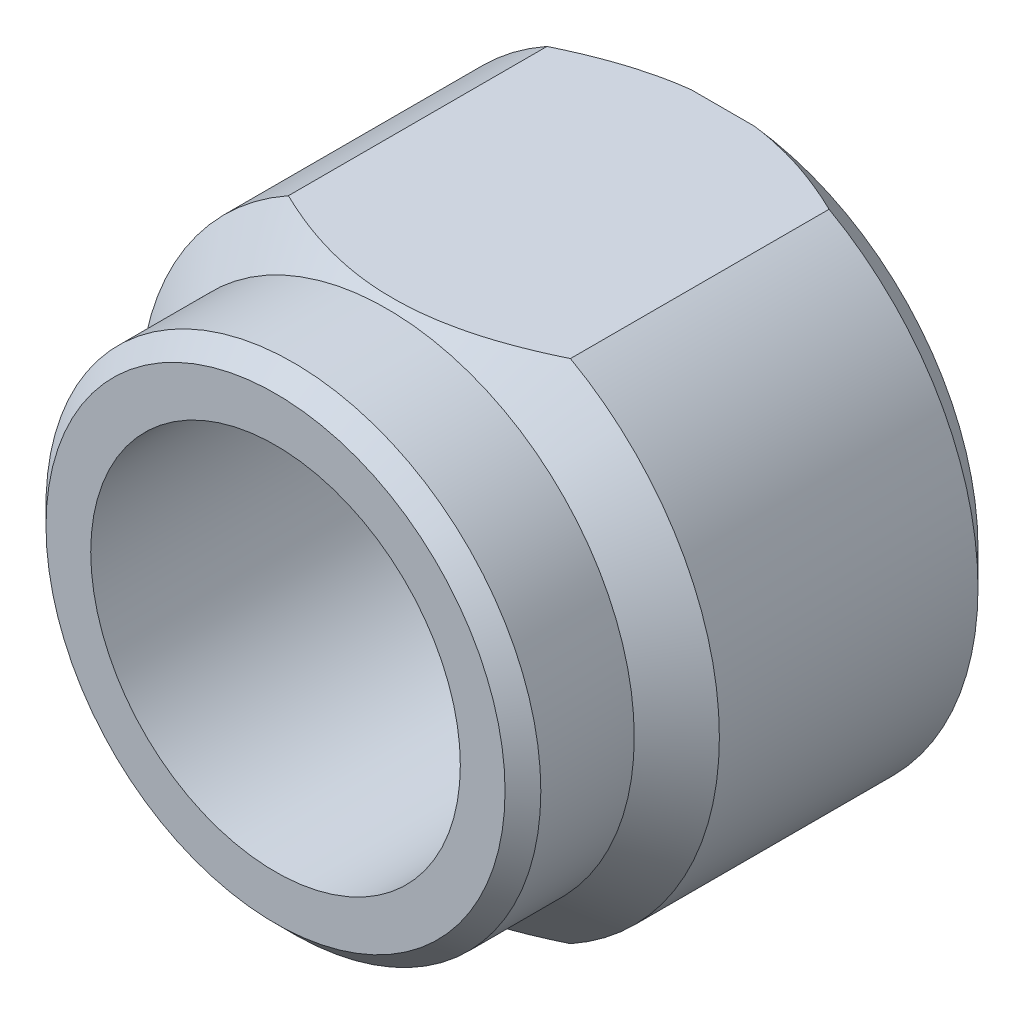
ISO-10303-21;
HEADER;
FILE_DESCRIPTION(('STEP AP214'),'2;1');
FILE_NAME('part.step','',(''),(''),'','','');
FILE_SCHEMA(('AUTOMOTIVE_DESIGN { 1 0 10303 214 1 1 1 1 }'));
ENDSEC;
DATA;
#1=APPLICATION_CONTEXT('core data for automotive mechanical design processes');
#2=APPLICATION_PROTOCOL_DEFINITION('international standard','automotive_design',2000,#1);
#3=PRODUCT_CONTEXT('',#1,'mechanical');
#4=PRODUCT('Part','Part','',(#3));
#5=PRODUCT_RELATED_PRODUCT_CATEGORY('part','',(#4));
#6=PRODUCT_DEFINITION_FORMATION('','',#4);
#7=PRODUCT_DEFINITION_CONTEXT('part definition',#1,'design');
#8=PRODUCT_DEFINITION('design','',#6,#7);
#9=PRODUCT_DEFINITION_SHAPE('','',#8);
#10=(LENGTH_UNIT() NAMED_UNIT(*) SI_UNIT(.MILLI.,.METRE.));
#11=(NAMED_UNIT(*) PLANE_ANGLE_UNIT() SI_UNIT($,.RADIAN.));
#12=(NAMED_UNIT(*) SI_UNIT($,.STERADIAN.) SOLID_ANGLE_UNIT());
#13=UNCERTAINTY_MEASURE_WITH_UNIT(LENGTH_MEASURE(1.E-05),#10,'distance_accuracy_value','');
#14=(GEOMETRIC_REPRESENTATION_CONTEXT(3) GLOBAL_UNCERTAINTY_ASSIGNED_CONTEXT((#13)) GLOBAL_UNIT_ASSIGNED_CONTEXT((#10,
#11,#12)) REPRESENTATION_CONTEXT('',''));
#15=CARTESIAN_POINT('',(0.,0.,0.));
#16=DIRECTION('',(0.,0.,1.));
#17=DIRECTION('',(1.,0.,0.));
#18=AXIS2_PLACEMENT_3D('',#15,#16,#17);
#19=CARTESIAN_POINT('',(0.,0.,0.));
#20=DIRECTION('',(0.,0.,1.));
#21=DIRECTION('',(1.,0.,0.));
#22=AXIS2_PLACEMENT_3D('',#19,#20,#21);
#23=CYLINDRICAL_SURFACE('',#22,4.864);
#24=CARTESIAN_POINT('',(0.,0.,0.581));
#25=DIRECTION('',(0.,0.,1.));
#26=DIRECTION('',(1.,0.,0.));
#27=AXIS2_PLACEMENT_3D('',#24,#25,#26);
#28=CIRCLE('',#27,4.864);
#29=CARTESIAN_POINT('',(2.36558576255438,-4.25,0.581));
#30=VERTEX_POINT('',#29);
#31=CARTESIAN_POINT('',(2.36558576255438,4.25,0.581));
#32=VERTEX_POINT('',#31);
#33=EDGE_CURVE('E146',#30,#32,#28,.T.);
#34=ORIENTED_EDGE('',*,*,#33,.T.);
#35=DIRECTION('',(0.,0.,1.));
#36=VECTOR('',#35,1.);
#37=CARTESIAN_POINT('',(2.36558576255438,4.25,0.));
#38=LINE('',#37,#36);
#39=CARTESIAN_POINT('',(2.36558576255438,4.25,4.919));
#40=VERTEX_POINT('',#39);
#41=EDGE_CURVE('E72',#32,#40,#38,.T.);
#42=ORIENTED_EDGE('',*,*,#41,.T.);
#43=CARTESIAN_POINT('',(0.,0.,4.919));
#44=DIRECTION('',(0.,0.,1.));
#45=DIRECTION('',(1.,0.,0.));
#46=AXIS2_PLACEMENT_3D('',#43,#44,#45);
#47=CIRCLE('',#46,4.864);
#48=CARTESIAN_POINT('',(2.36558576255438,-4.25,4.919));
#49=VERTEX_POINT('',#48);
#50=EDGE_CURVE('E156',#49,#40,#47,.T.);
#51=ORIENTED_EDGE('',*,*,#50,.F.);
#52=DIRECTION('',(0.,0.,1.));
#53=VECTOR('',#52,1.);
#54=CARTESIAN_POINT('',(2.36558576255438,-4.25,0.));
#55=LINE('',#54,#53);
#56=EDGE_CURVE('E199',#49,#30,#55,.F.);
#57=ORIENTED_EDGE('',*,*,#56,.T.);
#58=EDGE_LOOP('',(#34,#42,#51,#57));
#59=FACE_BOUND('',#58,.T.);
#60=ADVANCED_FACE('F43',(#59),#23,.T.);
#61=CARTESIAN_POINT('',(0.,0.,0.));
#62=DIRECTION('',(0.,0.,1.));
#63=DIRECTION('',(1.,0.,0.));
#64=AXIS2_PLACEMENT_3D('',#61,#62,#63);
#65=CONICAL_SURFACE('',#64,4.283,0.785398163397448);
#66=CARTESIAN_POINT('',(-2.36558576255438,4.25,0.581));
#67=VERTEX_POINT('',#66);
#68=CARTESIAN_POINT('',(-2.36558576255438,-4.25,0.581));
#69=VERTEX_POINT('',#68);
#70=EDGE_CURVE('E149',#67,#69,#28,.T.);
#71=ORIENTED_EDGE('',*,*,#70,.F.);
#72=CARTESIAN_POINT('',(-2.36702473371108,4.25,0.5817));
#73=CARTESIAN_POINT('',(-2.20341546665873,4.25,0.502152170576481));
#74=CARTESIAN_POINT('',(-2.03712267941439,4.25,0.427476792158866));
#75=CARTESIAN_POINT('',(-1.69832613474606,4.25,0.291111280149651));
#76=CARTESIAN_POINT('',(-1.52579435124547,4.25,0.229491383279684));
#77=CARTESIAN_POINT('',(-1.17795648173534,4.25,0.124164439222786));
#78=CARTESIAN_POINT('',(-1.00272785043013,4.25,0.0802086426752905));
#79=CARTESIAN_POINT('',(-0.648661502752726,4.25,0.0127223622306408));
#80=CARTESIAN_POINT('',(-0.469832857097767,4.25,-0.0108541465288452));
#81=CARTESIAN_POINT('',(-0.157386150327735,4.25,-0.0321606615733422));
#82=CARTESIAN_POINT('',(-0.0241051169132478,4.25,-0.0350178288431895));
#83=CARTESIAN_POINT('',(0.242185994142225,4.25,-0.0281850267203338));
#84=CARTESIAN_POINT('',(0.375195965056438,4.25,-0.0184908189484027));
#85=CARTESIAN_POINT('',(0.639896671662124,4.25,0.0128887656182992));
#86=CARTESIAN_POINT('',(0.771585992689131,4.25,0.0345858395075604));
#87=CARTESIAN_POINT('',(1.03267937650634,4.25,0.0887969650344073));
#88=CARTESIAN_POINT('',(1.16208363559851,4.25,0.121310082694479));
#89=CARTESIAN_POINT('',(1.38298330278897,4.25,0.185470964779138));
#90=CARTESIAN_POINT('',(1.47513485932578,4.25,0.214906813428511));
#91=CARTESIAN_POINT('',(1.65792586937361,4.25,0.278125669625865));
#92=CARTESIAN_POINT('',(1.74856541259322,4.25,0.311908418226168));
#93=CARTESIAN_POINT('',(1.92803574373158,4.25,0.383160420734027));
#94=CARTESIAN_POINT('',(2.01687140239177,4.25,0.420617497325784));
#95=CARTESIAN_POINT('',(2.19304753046299,4.25,0.498814353882238));
#96=CARTESIAN_POINT('',(2.28038857120033,4.25,0.539552843912989));
#97=CARTESIAN_POINT('',(2.36702473371108,4.25,0.5817));
#98=B_SPLINE_CURVE_WITH_KNOTS('',3,(#72,#73,#74,#75,#76,#77,#78,#79,#80,#81,#82,#83,#84,#85,#86,
#87,#88,#89,#90,#91,#92,#93,#94,#95,#96,#97),.UNSPECIFIED.,.F.,.F.,(4,2,2,2,2,2,2,2,2,2,2,2,4),
(0.,0.546116402567491,1.09510015208401,1.63605658678883,2.175788101994,2.57515595799535,
2.97465870869726,3.37455147245568,3.77440971398478,4.06451666965233,4.35460635145251,
4.64376517735736,4.93281088362659),.UNSPECIFIED.);
#99=CARTESIAN_POINT('',(-0.530649601903177,4.25,0.));
#100=VERTEX_POINT('',#99);
#101=EDGE_CURVE('E11',#67,#100,#98,.T.);
#102=ORIENTED_EDGE('',*,*,#101,.T.);
#103=CARTESIAN_POINT('',(0.,0.,0.));
#104=DIRECTION('',(0.,0.,1.));
#105=DIRECTION('',(1.,0.,0.));
#106=AXIS2_PLACEMENT_3D('',#103,#104,#105);
#107=CIRCLE('',#106,4.283);
#108=CARTESIAN_POINT('',(-0.530649601903177,-4.25,0.));
#109=VERTEX_POINT('',#108);
#110=EDGE_CURVE('E140',#100,#109,#107,.T.);
#111=ORIENTED_EDGE('',*,*,#110,.T.);
#112=CARTESIAN_POINT('',(2.36702473371108,-4.25,0.5817));
#113=CARTESIAN_POINT('',(2.20341546665873,-4.25,0.502152170576481));
#114=CARTESIAN_POINT('',(2.03712267941439,-4.25,0.427476792158866));
#115=CARTESIAN_POINT('',(1.69832613474606,-4.25,0.291111280149651));
#116=CARTESIAN_POINT('',(1.52579435124547,-4.25,0.229491383279684));
#117=CARTESIAN_POINT('',(1.17795648173534,-4.25,0.124164439222786));
#118=CARTESIAN_POINT('',(1.00272785043013,-4.25,0.0802086426752905));
#119=CARTESIAN_POINT('',(0.648661502752726,-4.25,0.0127223622306408));
#120=CARTESIAN_POINT('',(0.469832857097767,-4.25,-0.0108541465288452));
#121=CARTESIAN_POINT('',(0.157386150327735,-4.25,-0.0321606615733422));
#122=CARTESIAN_POINT('',(0.0241051169132478,-4.25,-0.0350178288431895));
#123=CARTESIAN_POINT('',(-0.242185994142225,-4.25,-0.0281850267203338));
#124=CARTESIAN_POINT('',(-0.375195965056438,-4.25,-0.0184908189484027));
#125=CARTESIAN_POINT('',(-0.639896671662124,-4.25,0.0128887656182992));
#126=CARTESIAN_POINT('',(-0.771585992689131,-4.25,0.0345858395075604));
#127=CARTESIAN_POINT('',(-1.03267937650634,-4.25,0.0887969650344073));
#128=CARTESIAN_POINT('',(-1.16208363559851,-4.25,0.121310082694479));
#129=CARTESIAN_POINT('',(-1.38298330278897,-4.25,0.185470964779138));
#130=CARTESIAN_POINT('',(-1.47513485932578,-4.25,0.214906813428511));
#131=CARTESIAN_POINT('',(-1.65792586937361,-4.25,0.278125669625865));
#132=CARTESIAN_POINT('',(-1.74856541259322,-4.25,0.311908418226168));
#133=CARTESIAN_POINT('',(-1.92803574373158,-4.25,0.383160420734027));
#134=CARTESIAN_POINT('',(-2.01687140239177,-4.25,0.420617497325784));
#135=CARTESIAN_POINT('',(-2.19304753046299,-4.25,0.498814353882238));
#136=CARTESIAN_POINT('',(-2.28038857120033,-4.25,0.539552843912989));
#137=CARTESIAN_POINT('',(-2.36702473371108,-4.25,0.5817));
#138=B_SPLINE_CURVE_WITH_KNOTS('',3,(#112,#113,#114,#115,#116,#117,#118,#119,#120,#121,#122,
#123,#124,#125,#126,#127,#128,#129,#130,#131,#132,#133,#134,#135,#136,#137),.UNSPECIFIED.,.F.,
.F.,(4,2,2,2,2,2,2,2,2,2,2,2,4),(0.,0.546116402567491,1.09510015208401,1.63605658678883,
2.175788101994,2.57515595799535,2.97465870869726,3.37455147245568,3.77440971398478,
4.06451666965233,4.35460635145251,4.64376517735736,4.93281088362659),.UNSPECIFIED.);
#139=EDGE_CURVE('E123',#109,#69,#138,.T.);
#140=ORIENTED_EDGE('',*,*,#139,.T.);
#141=EDGE_LOOP('',(#71,#102,#111,#140));
#142=FACE_BOUND('',#141,.T.);
#143=ADVANCED_FACE('F145',(#142),#65,.T.);
#144=CARTESIAN_POINT('',(0.,4.283,0.));
#145=DIRECTION('',(0.,0.,1.));
#146=DIRECTION('',(1.,0.,0.));
#147=AXIS2_PLACEMENT_3D('',#144,#145,#146);
#148=PLANE('',#147);
#149=ORIENTED_EDGE('',*,*,#110,.F.);
#150=DIRECTION('',(-1.,0.,0.));
#151=VECTOR('',#150,1.);
#152=CARTESIAN_POINT('',(10.,4.25,0.));
#153=LINE('',#152,#151);
#154=CARTESIAN_POINT('',(0.530649601903177,4.25,0.));
#155=VERTEX_POINT('',#154);
#156=EDGE_CURVE('E143',#155,#100,#153,.T.);
#157=ORIENTED_EDGE('',*,*,#156,.F.);
#158=CARTESIAN_POINT('',(0.530649601903177,-4.25,0.));
#159=VERTEX_POINT('',#158);
#160=EDGE_CURVE('E142',#159,#155,#107,.T.);
#161=ORIENTED_EDGE('',*,*,#160,.F.);
#162=DIRECTION('',(1.,0.,0.));
#163=VECTOR('',#162,1.);
#164=CARTESIAN_POINT('',(-10.,-4.25,0.));
#165=LINE('',#164,#163);
#166=EDGE_CURVE('E126',#109,#159,#165,.T.);
#167=ORIENTED_EDGE('',*,*,#166,.F.);
#168=EDGE_LOOP('',(#149,#157,#161,#167));
#169=FACE_BOUND('',#168,.T.);
#170=DIRECTION('',(0.,1.,0.));
#171=VECTOR('',#170,1.);
#172=CARTESIAN_POINT('',(-3.1,-0.5,0.));
#173=LINE('',#172,#171);
#174=CARTESIAN_POINT('',(-3.1,-0.5,0.));
#175=VERTEX_POINT('',#174);
#176=CARTESIAN_POINT('',(-3.1,0.5,0.));
#177=VERTEX_POINT('',#176);
#178=EDGE_CURVE('E238',#175,#177,#173,.T.);
#179=ORIENTED_EDGE('',*,*,#178,.F.);
#180=DIRECTION('',(1.,0.,0.));
#181=VECTOR('',#180,1.);
#182=CARTESIAN_POINT('',(-3.1,-0.5,0.));
#183=LINE('',#182,#181);
#184=CARTESIAN_POINT('',(3.1,-0.5,0.));
#185=VERTEX_POINT('',#184);
#186=EDGE_CURVE('E246',#175,#185,#183,.T.);
#187=ORIENTED_EDGE('',*,*,#186,.T.);
#188=DIRECTION('',(0.,1.,0.));
#189=VECTOR('',#188,1.);
#190=CARTESIAN_POINT('',(3.1,-0.5,0.));
#191=LINE('',#190,#189);
#192=CARTESIAN_POINT('',(3.1,0.5,0.));
#193=VERTEX_POINT('',#192);
#194=EDGE_CURVE('E226',#185,#193,#191,.T.);
#195=ORIENTED_EDGE('',*,*,#194,.T.);
#196=DIRECTION('',(1.,0.,0.));
#197=VECTOR('',#196,1.);
#198=CARTESIAN_POINT('',(-3.1,0.5,0.));
#199=LINE('',#198,#197);
#200=EDGE_CURVE('E244',#177,#193,#199,.T.);
#201=ORIENTED_EDGE('',*,*,#200,.F.);
#202=EDGE_LOOP('',(#179,#187,#195,#201));
#203=FACE_BOUND('',#202,.T.);
#204=ADVANCED_FACE('F137',(#169,#203),#148,.F.);
#205=CARTESIAN_POINT('',(0.,0.,2.3));
#206=DIRECTION('',(0.,0.,-1.));
#207=DIRECTION('',(-1.,0.,0.));
#208=AXIS2_PLACEMENT_3D('',#205,#206,#207);
#209=PLANE('',#208);
#210=CARTESIAN_POINT('',(0.,0.,2.3));
#211=DIRECTION('',(0.,0.,1.));
#212=DIRECTION('',(1.,0.,0.));
#213=AXIS2_PLACEMENT_3D('',#210,#211,#212);
#214=CIRCLE('',#213,3.1);
#215=CARTESIAN_POINT('',(3.1,0.,2.3));
#216=VERTEX_POINT('',#215);
#217=EDGE_CURVE('E133',#216,#216,#214,.T.);
#218=ORIENTED_EDGE('',*,*,#217,.T.);
#219=EDGE_LOOP('',(#218));
#220=FACE_BOUND('',#219,.T.);
#221=ADVANCED_FACE('F45',(#220),#209,.F.);
#222=CARTESIAN_POINT('',(0.,0.,0.));
#223=DIRECTION('',(0.,0.,1.));
#224=DIRECTION('',(1.,0.,0.));
#225=AXIS2_PLACEMENT_3D('',#222,#223,#224);
#226=CYLINDRICAL_SURFACE('',#225,3.1);
#227=ORIENTED_EDGE('',*,*,#217,.F.);
#228=EDGE_LOOP('',(#227));
#229=FACE_BOUND('',#228,.T.);
#230=CARTESIAN_POINT('',(0.,0.,7.5));
#231=DIRECTION('',(0.,0.,1.));
#232=DIRECTION('',(1.,0.,0.));
#233=AXIS2_PLACEMENT_3D('',#230,#231,#232);
#234=CIRCLE('',#233,3.1);
#235=CARTESIAN_POINT('',(3.1,0.,7.5));
#236=VERTEX_POINT('',#235);
#237=EDGE_CURVE('E169',#236,#236,#234,.T.);
#238=ORIENTED_EDGE('',*,*,#237,.T.);
#239=EDGE_LOOP('',(#238));
#240=FACE_BOUND('',#239,.T.);
#241=ADVANCED_FACE('F268',(#229,#240),#226,.F.);
#242=CARTESIAN_POINT('',(0.,3.1,7.5));
#243=DIRECTION('',(0.,0.,-1.));
#244=DIRECTION('',(-1.,0.,0.));
#245=AXIS2_PLACEMENT_3D('',#242,#243,#244);
#246=PLANE('',#245);
#247=ORIENTED_EDGE('',*,*,#237,.F.);
#248=EDGE_LOOP('',(#247));
#249=FACE_BOUND('',#248,.T.);
#250=CARTESIAN_POINT('',(0.,0.,7.5));
#251=DIRECTION('',(0.,0.,1.));
#252=DIRECTION('',(1.,0.,0.));
#253=AXIS2_PLACEMENT_3D('',#250,#251,#252);
#254=CIRCLE('',#253,3.85);
#255=CARTESIAN_POINT('',(3.85,0.,7.5));
#256=VERTEX_POINT('',#255);
#257=EDGE_CURVE('E166',#256,#256,#254,.T.);
#258=ORIENTED_EDGE('',*,*,#257,.T.);
#259=EDGE_LOOP('',(#258));
#260=FACE_BOUND('',#259,.T.);
#261=ADVANCED_FACE('F349',(#249,#260),#246,.F.);
#262=CARTESIAN_POINT('',(0.,0.,7.2));
#263=DIRECTION('',(0.,0.,-1.));
#264=DIRECTION('',(-1.,0.,0.));
#265=AXIS2_PLACEMENT_3D('',#262,#263,#264);
#266=CONICAL_SURFACE('',#265,4.15,0.78539816339745);
#267=ORIENTED_EDGE('',*,*,#257,.F.);
#268=EDGE_LOOP('',(#267));
#269=FACE_BOUND('',#268,.T.);
#270=CARTESIAN_POINT('',(0.,0.,7.2));
#271=DIRECTION('',(0.,0.,1.));
#272=DIRECTION('',(1.,0.,0.));
#273=AXIS2_PLACEMENT_3D('',#270,#271,#272);
#274=CIRCLE('',#273,4.15);
#275=CARTESIAN_POINT('',(4.15,0.,7.2));
#276=VERTEX_POINT('',#275);
#277=EDGE_CURVE('E163',#276,#276,#274,.T.);
#278=ORIENTED_EDGE('',*,*,#277,.T.);
#279=EDGE_LOOP('',(#278));
#280=FACE_BOUND('',#279,.T.);
#281=ADVANCED_FACE('F360',(#269,#280),#266,.T.);
#282=CARTESIAN_POINT('',(0.,0.,0.));
#283=DIRECTION('',(0.,0.,1.));
#284=DIRECTION('',(1.,0.,0.));
#285=AXIS2_PLACEMENT_3D('',#282,#283,#284);
#286=CYLINDRICAL_SURFACE('',#285,4.15);
#287=ORIENTED_EDGE('',*,*,#277,.F.);
#288=EDGE_LOOP('',(#287));
#289=FACE_BOUND('',#288,.T.);
#290=CARTESIAN_POINT('',(0.,0.,5.633));
#291=DIRECTION('',(0.,0.,1.));
#292=DIRECTION('',(1.,0.,0.));
#293=AXIS2_PLACEMENT_3D('',#290,#291,#292);
#294=CIRCLE('',#293,4.15);
#295=CARTESIAN_POINT('',(4.15,0.,5.633));
#296=VERTEX_POINT('',#295);
#297=EDGE_CURVE('E160',#296,#296,#294,.T.);
#298=ORIENTED_EDGE('',*,*,#297,.T.);
#299=EDGE_LOOP('',(#298));
#300=FACE_BOUND('',#299,.T.);
#301=ADVANCED_FACE('F206',(#289,#300),#286,.T.);
#302=CARTESIAN_POINT('',(0.,0.,4.919));
#303=DIRECTION('',(0.,0.,-1.));
#304=DIRECTION('',(-1.,0.,0.));
#305=AXIS2_PLACEMENT_3D('',#302,#303,#304);
#306=CONICAL_SURFACE('',#305,4.864,0.785398163397448);
#307=ORIENTED_EDGE('',*,*,#297,.F.);
#308=EDGE_LOOP('',(#307));
#309=FACE_BOUND('',#308,.T.);
#310=ORIENTED_EDGE('',*,*,#50,.T.);
#311=CARTESIAN_POINT('',(13.9869282883252,4.25,-4.83536731453794));
#312=CARTESIAN_POINT('',(13.7275350624023,4.25,-4.58718782386959));
#313=CARTESIAN_POINT('',(13.4678588682174,4.25,-4.33930333575501));
#314=CARTESIAN_POINT('',(12.9478175573449,4.25,-3.84425451690662));
#315=CARTESIAN_POINT('',(12.6874524358202,4.25,-3.59709019125495));
#316=CARTESIAN_POINT('',(12.1658470016301,4.25,-3.10355201772493));
#317=CARTESIAN_POINT('',(11.9046064814828,4.25,-2.85717838902092));
#318=CARTESIAN_POINT('',(11.3811565438962,4.25,-2.36546335823841));
#319=CARTESIAN_POINT('',(11.1189471288379,4.25,-2.1201219536266));
#320=CARTESIAN_POINT('',(10.5923035818603,4.25,-1.62971831084991));
#321=CARTESIAN_POINT('',(10.3278647460826,4.25,-1.38466112087686));
#322=CARTESIAN_POINT('',(9.79753815106607,4.25,-0.896119918269178));
#323=CARTESIAN_POINT('',(9.5316503964724,4.25,-0.652635900596457));
#324=CARTESIAN_POINT('',(8.99810329507737,4.25,-0.167677446152877));
#325=CARTESIAN_POINT('',(8.73044415897843,4.25,0.0737972221784447));
#326=CARTESIAN_POINT('',(8.19285191685059,4.25,0.554199977385389));
#327=CARTESIAN_POINT('',(7.92291883793459,4.25,0.793128094547576));
#328=CARTESIAN_POINT('',(7.36957635691951,4.25,1.27686146015354));
#329=CARTESIAN_POINT('',(7.08605093204626,4.25,1.52153421878827));
#330=CARTESIAN_POINT('',(6.51477319837017,4.25,2.00599899083421));
#331=CARTESIAN_POINT('',(6.2270203431442,4.25,2.24579036356604));
#332=CARTESIAN_POINT('',(5.79111345850879,4.25,2.60021463283525));
#333=CARTESIAN_POINT('',(5.64509891945672,4.25,2.71747839082348));
#334=CARTESIAN_POINT('',(5.35138068341636,4.25,2.94986830545508));
#335=CARTESIAN_POINT('',(5.20367702633971,4.25,3.06499451243802));
#336=CARTESIAN_POINT('',(4.9062976559398,4.25,3.29261466671205));
#337=CARTESIAN_POINT('',(4.756622347499,4.25,3.40510914165856));
#338=CARTESIAN_POINT('',(4.45489447367663,4.25,3.62685550870325));
#339=CARTESIAN_POINT('',(4.30284202802757,4.25,3.7361075633186));
#340=CARTESIAN_POINT('',(3.97943843655907,4.25,3.96203554128582));
#341=CARTESIAN_POINT('',(3.80776497083564,4.25,4.07825283296351));
#342=CARTESIAN_POINT('',(3.46018297668612,4.25,4.30414008511735));
#343=CARTESIAN_POINT('',(3.28427519360924,4.25,4.41381118623533));
#344=CARTESIAN_POINT('',(2.92727822958193,4.25,4.62444470933911));
#345=CARTESIAN_POINT('',(2.74618967717297,4.25,4.7254081818354));
#346=CARTESIAN_POINT('',(2.37799579430363,4.25,4.91550860652832));
#347=CARTESIAN_POINT('',(2.19089303454912,4.25,5.00465053035007));
#348=CARTESIAN_POINT('',(1.74413180125749,4.25,5.19486660059345));
#349=CARTESIAN_POINT('',(1.48158567690936,4.25,5.28955794848501));
#350=CARTESIAN_POINT('',(1.07952005466374,4.25,5.39992737451709));
#351=CARTESIAN_POINT('',(0.944320178734198,4.25,5.43141705174548));
#352=CARTESIAN_POINT('',(0.671633151405314,4.25,5.48234016622563));
#353=CARTESIAN_POINT('',(0.534146268489787,4.25,5.50177500854382));
#354=CARTESIAN_POINT('',(0.256351018346374,4.25,5.52754625599352));
#355=CARTESIAN_POINT('',(0.116028345554844,4.25,5.53373118239121));
#356=CARTESIAN_POINT('',(-0.164532333123868,4.25,5.53213042833195));
#357=CARTESIAN_POINT('',(-0.304770340958334,4.25,5.52434508246758));
#358=CARTESIAN_POINT('',(-0.584051656498258,4.25,5.49531040973488));
#359=CARTESIAN_POINT('',(-0.723092640842093,4.25,5.47403912959039));
#360=CARTESIAN_POINT('',(-0.998743484688199,4.25,5.41931884913719));
#361=CARTESIAN_POINT('',(-1.13535274343039,4.25,5.38586688219948));
#362=CARTESIAN_POINT('',(-1.46455678770127,4.25,5.29158283850048));
#363=CARTESIAN_POINT('',(-1.65554553413144,4.25,5.22517346358106));
#364=CARTESIAN_POINT('',(-2.03092991453161,4.25,5.07583322455998));
#365=CARTESIAN_POINT('',(-2.21532088825754,4.25,4.99289094416924));
#366=CARTESIAN_POINT('',(-2.48777802462694,4.25,4.85905166934393));
#367=CARTESIAN_POINT('',(-2.57814271055011,4.25,4.81273227573298));
#368=CARTESIAN_POINT('',(-2.75744748362029,4.25,4.71740589184315));
#369=CARTESIAN_POINT('',(-2.84638755562102,4.25,4.66839887301433));
#370=CARTESIAN_POINT('',(-3.02291340793654,4.25,4.56809514655158));
#371=CARTESIAN_POINT('',(-3.11049972915073,4.25,4.51679938700213));
#372=CARTESIAN_POINT('',(-3.28446343910439,4.25,4.41221072303725));
#373=CARTESIAN_POINT('',(-3.37084087857758,4.25,4.35891790278074));
#374=CARTESIAN_POINT('',(-3.65725550179267,4.25,4.17820519844875));
#375=CARTESIAN_POINT('',(-3.85486593510772,4.25,4.04693281157468));
#376=CARTESIAN_POINT('',(-4.24537003105066,4.25,3.77752458462824));
#377=CARTESIAN_POINT('',(-4.43826252195451,4.25,3.63938706488158));
#378=CARTESIAN_POINT('',(-4.82042071910699,4.25,3.35787332597203));
#379=CARTESIAN_POINT('',(-5.00968327575141,4.25,3.21449284561659));
#380=CARTESIAN_POINT('',(-5.38514843644295,4.25,2.92382953234819));
#381=CARTESIAN_POINT('',(-5.57135131284332,4.25,2.77654704984888));
#382=CARTESIAN_POINT('',(-5.94178149804154,4.25,2.47854008456469));
#383=CARTESIAN_POINT('',(-6.12600234436387,4.25,2.32780758722208));
#384=CARTESIAN_POINT('',(-6.49242149374944,4.25,2.02390241425162));
#385=CARTESIAN_POINT('',(-6.67461975895857,4.25,1.87072969308335));
#386=CARTESIAN_POINT('',(-7.21855700111534,4.25,1.4084341444129));
#387=CARTESIAN_POINT('',(-7.57781328307804,4.25,1.09639167448553));
#388=CARTESIAN_POINT('',(-8.29219781313457,4.25,0.466629330679932));
#389=CARTESIAN_POINT('',(-8.64731946343339,4.25,0.148902013314677));
#390=CARTESIAN_POINT('',(-9.35421802755528,4.25,-0.490321535596403));
#391=CARTESIAN_POINT('',(-9.7059945825837,4.25,-0.811818163361194));
#392=CARTESIAN_POINT('',(-10.4065639264739,4.25,-1.45713110697328));
#393=CARTESIAN_POINT('',(-10.7553600003754,4.25,-1.78094386291157));
#394=CARTESIAN_POINT('',(-11.451021162578,4.25,-2.43063726624952));
#395=CARTESIAN_POINT('',(-11.7978862455648,4.25,-2.75651791933507));
#396=CARTESIAN_POINT('',(-12.2982509274995,4.25,-3.22879840622246));
#397=CARTESIAN_POINT('',(-12.45235730607,4.25,-3.37455627931414));
#398=CARTESIAN_POINT('',(-12.760325857041,4.25,-3.66638627859745));
#399=CARTESIAN_POINT('',(-12.9141879795571,4.25,-3.81245845744539));
#400=CARTESIAN_POINT('',(-13.2213383577634,4.25,-4.10454969158929));
#401=CARTESIAN_POINT('',(-13.3746271375319,4.25,-4.25056819592707));
#402=CARTESIAN_POINT('',(-13.6809534910917,4.25,-4.54281196562844));
#403=CARTESIAN_POINT('',(-13.8339911059979,4.25,-4.68903718789374));
#404=CARTESIAN_POINT('',(-13.9869282883252,4.25,-4.83536731453794));
#405=B_SPLINE_CURVE_WITH_KNOTS('',3,(#311,#312,#313,#314,#315,#316,#317,#318,#319,#320,#321,
#322,#323,#324,#325,#326,#327,#328,#329,#330,#331,#332,#333,#334,#335,#336,#337,#338,#339,#340,
#341,#342,#343,#344,#345,#346,#347,#348,#349,#350,#351,#352,#353,#354,#355,#356,#357,#358,#359,
#360,#361,#362,#363,#364,#365,#366,#367,#368,#369,#370,#371,#372,#373,#374,#375,#376,#377,#378,
#379,#380,#381,#382,#383,#384,#385,#386,#387,#388,#389,#390,#391,#392,#393,#394,#395,#396,#397,
#398,#399,#400,#401,#402,#403,#404),.UNSPECIFIED.,.F.,.F.,(4,2,2,2,2,2,2,2,2,2,2,2,2,2,2,2,2,2,
2,2,2,2,2,2,2,2,2,2,2,2,2,2,2,2,2,2,2,2,2,2,2,2,2,2,2,2,4),(0.,1.07698761135873,
2.15398280460625,3.23125442942469,4.30852340881822,5.39010437691108,6.471681879522,
7.55313296355055,8.63457117131374,9.75804002096098,10.8816553867943,11.4434578408293,
12.0052470475266,12.5669226344983,13.1285700213563,13.7503895992063,14.3721005098127,
14.9937363104047,15.6151098435054,16.4494641070707,16.8654697983522,17.2814269924523,
17.7021147573,18.1227924466727,18.5441567069158,18.9656236599283,19.5711624785132,
20.177120890907,20.4817182775902,20.7863189005582,21.0907944968628,21.3952572765412,
22.1067457710718,22.8184092089831,23.53066449751,24.2428560383558,24.9569155278032,
25.6709883589546,27.0984579358445,28.5279577305108,29.9576091618517,31.3854015999977,
32.8131979657069,33.4495523526348,34.0860232638119,34.7211369312477,35.3561334680093),.UNSPECIFIED.);
#406=CARTESIAN_POINT('',(-2.36558576255438,4.25,4.919));
#407=VERTEX_POINT('',#406);
#408=EDGE_CURVE('E211',#40,#407,#405,.T.);
#409=ORIENTED_EDGE('',*,*,#408,.T.);
#410=CARTESIAN_POINT('',(-2.36558576255438,-4.25,4.919));
#411=VERTEX_POINT('',#410);
#412=EDGE_CURVE('E159',#407,#411,#47,.T.);
#413=ORIENTED_EDGE('',*,*,#412,.T.);
#414=CARTESIAN_POINT('',(-13.9869282883252,-4.25,-4.83536731453793));
#415=CARTESIAN_POINT('',(-13.7275350624022,-4.25,-4.58718782386958));
#416=CARTESIAN_POINT('',(-13.4678588682174,-4.25,-4.339303335755));
#417=CARTESIAN_POINT('',(-12.9478175573449,-4.25,-3.84425451690662));
#418=CARTESIAN_POINT('',(-12.6874524358202,-4.25,-3.59709019125494));
#419=CARTESIAN_POINT('',(-12.1658470016301,-4.25,-3.10355201772493));
#420=CARTESIAN_POINT('',(-11.9046064814827,-4.25,-2.85717838902091));
#421=CARTESIAN_POINT('',(-11.3811565438962,-4.25,-2.3654633582384));
#422=CARTESIAN_POINT('',(-11.1189471288378,-4.25,-2.12012195362659));
#423=CARTESIAN_POINT('',(-10.5923035818603,-4.25,-1.62971831084991));
#424=CARTESIAN_POINT('',(-10.3278647460826,-4.25,-1.38466112087686));
#425=CARTESIAN_POINT('',(-9.79753815106606,-4.25,-0.896119918269174));
#426=CARTESIAN_POINT('',(-9.53165039647239,-4.25,-0.652635900596451));
#427=CARTESIAN_POINT('',(-8.99810329507736,-4.25,-0.167677446152872));
#428=CARTESIAN_POINT('',(-8.73044415897843,-4.25,0.0737972221784491));
#429=CARTESIAN_POINT('',(-8.19285191685059,-4.25,0.554199977385393));
#430=CARTESIAN_POINT('',(-7.92291883793458,-4.25,0.79312809454758));
#431=CARTESIAN_POINT('',(-7.36957635691951,-4.25,1.27686146015355));
#432=CARTESIAN_POINT('',(-7.08605093204625,-4.25,1.52153421878828));
#433=CARTESIAN_POINT('',(-6.51477319837016,-4.25,2.00599899083422));
#434=CARTESIAN_POINT('',(-6.22702034314419,-4.25,2.24579036356605));
#435=CARTESIAN_POINT('',(-5.79111345850878,-4.25,2.60021463283525));
#436=CARTESIAN_POINT('',(-5.64509891945672,-4.25,2.71747839082348));
#437=CARTESIAN_POINT('',(-5.35138068341636,-4.25,2.94986830545508));
#438=CARTESIAN_POINT('',(-5.2036770263397,-4.25,3.06499451243802));
#439=CARTESIAN_POINT('',(-4.90629765593979,-4.25,3.29261466671205));
#440=CARTESIAN_POINT('',(-4.75662234749899,-4.25,3.40510914165857));
#441=CARTESIAN_POINT('',(-4.45489447367662,-4.25,3.62685550870325));
#442=CARTESIAN_POINT('',(-4.30284202802756,-4.25,3.7361075633186));
#443=CARTESIAN_POINT('',(-3.97943843655906,-4.25,3.96203554128582));
#444=CARTESIAN_POINT('',(-3.80776497083563,-4.25,4.07825283296352));
#445=CARTESIAN_POINT('',(-3.46018297668612,-4.25,4.30414008511735));
#446=CARTESIAN_POINT('',(-3.28427519360924,-4.25,4.41381118623534));
#447=CARTESIAN_POINT('',(-2.92727822958193,-4.25,4.62444470933911));
#448=CARTESIAN_POINT('',(-2.74618967717297,-4.25,4.7254081818354));
#449=CARTESIAN_POINT('',(-2.37799579430363,-4.25,4.91550860652832));
#450=CARTESIAN_POINT('',(-2.19089303454912,-4.25,5.00465053035007));
#451=CARTESIAN_POINT('',(-1.74413180125749,-4.25,5.19486660059345));
#452=CARTESIAN_POINT('',(-1.48158567690936,-4.25,5.28955794848501));
#453=CARTESIAN_POINT('',(-1.07952005466374,-4.25,5.39992737451709));
#454=CARTESIAN_POINT('',(-0.944320178734197,-4.25,5.43141705174548));
#455=CARTESIAN_POINT('',(-0.671633151405313,-4.25,5.48234016622563));
#456=CARTESIAN_POINT('',(-0.534146268489786,-4.25,5.50177500854382));
#457=CARTESIAN_POINT('',(-0.256351018346372,-4.25,5.52754625599352));
#458=CARTESIAN_POINT('',(-0.11602834555484,-4.25,5.53373118239121));
#459=CARTESIAN_POINT('',(0.164532333123873,-4.25,5.53213042833194));
#460=CARTESIAN_POINT('',(0.304770340958338,-4.25,5.52434508246758));
#461=CARTESIAN_POINT('',(0.584051656498261,-4.25,5.49531040973488));
#462=CARTESIAN_POINT('',(0.723092640842097,-4.25,5.47403912959039));
#463=CARTESIAN_POINT('',(0.998743484688202,-4.25,5.41931884913719));
#464=CARTESIAN_POINT('',(1.13535274343039,-4.25,5.38586688219948));
#465=CARTESIAN_POINT('',(1.46455678770127,-4.25,5.29158283850048));
#466=CARTESIAN_POINT('',(1.65554553413144,-4.25,5.22517346358106));
#467=CARTESIAN_POINT('',(2.03092991453161,-4.25,5.07583322455998));
#468=CARTESIAN_POINT('',(2.21532088825755,-4.25,4.99289094416923));
#469=CARTESIAN_POINT('',(2.48777802462694,-4.25,4.85905166934393));
#470=CARTESIAN_POINT('',(2.57814271055011,-4.25,4.81273227573298));
#471=CARTESIAN_POINT('',(2.75744748362029,-4.25,4.71740589184315));
#472=CARTESIAN_POINT('',(2.84638755562102,-4.25,4.66839887301433));
#473=CARTESIAN_POINT('',(3.02291340793654,-4.25,4.56809514655158));
#474=CARTESIAN_POINT('',(3.11049972915074,-4.25,4.51679938700213));
#475=CARTESIAN_POINT('',(3.28446343910439,-4.25,4.41221072303725));
#476=CARTESIAN_POINT('',(3.37084087857759,-4.25,4.35891790278073));
#477=CARTESIAN_POINT('',(3.65725550179267,-4.25,4.17820519844874));
#478=CARTESIAN_POINT('',(3.85486593510772,-4.25,4.04693281157468));
#479=CARTESIAN_POINT('',(4.24537003105066,-4.25,3.77752458462824));
#480=CARTESIAN_POINT('',(4.43826252195452,-4.25,3.63938706488157));
#481=CARTESIAN_POINT('',(4.82042071910699,-4.25,3.35787332597203));
#482=CARTESIAN_POINT('',(5.00968327575141,-4.25,3.21449284561659));
#483=CARTESIAN_POINT('',(5.38514843644295,-4.25,2.92382953234818));
#484=CARTESIAN_POINT('',(5.57135131284333,-4.25,2.77654704984887));
#485=CARTESIAN_POINT('',(5.94178149804155,-4.25,2.47854008456468));
#486=CARTESIAN_POINT('',(6.12600234436387,-4.25,2.32780758722208));
#487=CARTESIAN_POINT('',(6.49242149374945,-4.25,2.02390241425161));
#488=CARTESIAN_POINT('',(6.67461975895858,-4.25,1.87072969308334));
#489=CARTESIAN_POINT('',(7.21855700111534,-4.25,1.40843414441289));
#490=CARTESIAN_POINT('',(7.57781328307805,-4.25,1.09639167448553));
#491=CARTESIAN_POINT('',(8.29219781313458,-4.25,0.466629330679924));
#492=CARTESIAN_POINT('',(8.6473194634334,-4.25,0.148902013314668));
#493=CARTESIAN_POINT('',(9.35421802755529,-4.25,-0.490321535596413));
#494=CARTESIAN_POINT('',(9.70599458258371,-4.25,-0.811818163361202));
#495=CARTESIAN_POINT('',(10.406563926474,-4.25,-1.45713110697329));
#496=CARTESIAN_POINT('',(10.7553600003754,-4.25,-1.78094386291158));
#497=CARTESIAN_POINT('',(11.451021162578,-4.25,-2.43063726624953));
#498=CARTESIAN_POINT('',(11.7978862455648,-4.25,-2.75651791933508));
#499=CARTESIAN_POINT('',(12.2982509274995,-4.25,-3.22879840622247));
#500=CARTESIAN_POINT('',(12.45235730607,-4.25,-3.37455627931415));
#501=CARTESIAN_POINT('',(12.760325857041,-4.25,-3.66638627859746));
#502=CARTESIAN_POINT('',(12.9141879795571,-4.25,-3.81245845744539));
#503=CARTESIAN_POINT('',(13.2213383577634,-4.25,-4.1045496915893));
#504=CARTESIAN_POINT('',(13.3746271375319,-4.25,-4.25056819592707));
#505=CARTESIAN_POINT('',(13.6809534910917,-4.25,-4.54281196562844));
#506=CARTESIAN_POINT('',(13.8339911059979,-4.25,-4.68903718789373));
#507=CARTESIAN_POINT('',(13.9869282883252,-4.25,-4.83536731453793));
#508=B_SPLINE_CURVE_WITH_KNOTS('',3,(#414,#415,#416,#417,#418,#419,#420,#421,#422,#423,#424,
#425,#426,#427,#428,#429,#430,#431,#432,#433,#434,#435,#436,#437,#438,#439,#440,#441,#442,#443,
#444,#445,#446,#447,#448,#449,#450,#451,#452,#453,#454,#455,#456,#457,#458,#459,#460,#461,#462,
#463,#464,#465,#466,#467,#468,#469,#470,#471,#472,#473,#474,#475,#476,#477,#478,#479,#480,#481,
#482,#483,#484,#485,#486,#487,#488,#489,#490,#491,#492,#493,#494,#495,#496,#497,#498,#499,#500,
#501,#502,#503,#504,#505,#506,#507),.UNSPECIFIED.,.F.,.F.,(4,2,2,2,2,2,2,2,2,2,2,2,2,2,2,2,2,2,
2,2,2,2,2,2,2,2,2,2,2,2,2,2,2,2,2,2,2,2,2,2,2,2,2,2,2,2,4),(0.,1.07698761135873,
2.15398280460624,3.23125442942469,4.30852340881821,5.39010437691107,6.471681879522,
7.55313296355055,8.63457117131373,9.75804002096097,10.8816553867943,11.4434578408293,
12.0052470475265,12.5669226344983,13.1285700213563,13.7503895992063,14.3721005098127,
14.9937363104047,15.6151098435054,16.4494641070707,16.8654697983522,17.2814269924523,
17.7021147573,18.1227924466727,18.5441567069158,18.9656236599283,19.5711624785132,
20.177120890907,20.4817182775902,20.7863189005582,21.0907944968628,21.3952572765412,
22.1067457710718,22.8184092089831,23.53066449751,24.2428560383558,24.9569155278032,
25.6709883589546,27.0984579358445,28.5279577305108,29.9576091618517,31.3854015999977,
32.8131979657069,33.4495523526348,34.0860232638119,34.7211369312477,35.3561334680093),.UNSPECIFIED.);
#509=EDGE_CURVE('E190',#411,#49,#508,.T.);
#510=ORIENTED_EDGE('',*,*,#509,.T.);
#511=EDGE_LOOP('',(#310,#409,#413,#510));
#512=FACE_BOUND('',#511,.T.);
#513=ADVANCED_FACE('F201',(#309,#512),#306,.T.);
#514=ORIENTED_EDGE('',*,*,#412,.F.);
#515=DIRECTION('',(0.,0.,1.));
#516=VECTOR('',#515,1.);
#517=CARTESIAN_POINT('',(-2.36558576255438,4.25,0.));
#518=LINE('',#517,#516);
#519=EDGE_CURVE('E218',#407,#67,#518,.F.);
#520=ORIENTED_EDGE('',*,*,#519,.T.);
#521=ORIENTED_EDGE('',*,*,#70,.T.);
#522=DIRECTION('',(0.,0.,1.));
#523=VECTOR('',#522,1.);
#524=CARTESIAN_POINT('',(-2.36558576255438,-4.25,0.));
#525=LINE('',#524,#523);
#526=EDGE_CURVE('E64',#69,#411,#525,.T.);
#527=ORIENTED_EDGE('',*,*,#526,.T.);
#528=EDGE_LOOP('',(#514,#520,#521,#527));
#529=FACE_BOUND('',#528,.T.);
#530=ADVANCED_FACE('F205',(#529),#23,.T.);
#531=ORIENTED_EDGE('',*,*,#160,.T.);
#532=EDGE_CURVE('E47',#155,#32,#98,.T.);
#533=ORIENTED_EDGE('',*,*,#532,.T.);
#534=ORIENTED_EDGE('',*,*,#33,.F.);
#535=EDGE_CURVE('E132',#30,#159,#138,.T.);
#536=ORIENTED_EDGE('',*,*,#535,.T.);
#537=EDGE_LOOP('',(#531,#533,#534,#536));
#538=FACE_BOUND('',#537,.T.);
#539=ADVANCED_FACE('F178',(#538),#65,.T.);
#540=CARTESIAN_POINT('',(-3.1,0.36876700471111,1.5));
#541=DIRECTION('',(0.,0.,1.));
#542=DIRECTION('',(1.,0.,0.));
#543=AXIS2_PLACEMENT_3D('',#540,#541,#542);
#544=PLANE('',#543);
#545=DIRECTION('',(1.,0.,0.));
#546=VECTOR('',#545,1.);
#547=CARTESIAN_POINT('',(-3.1,-0.36876700471111,1.5));
#548=LINE('',#547,#546);
#549=CARTESIAN_POINT('',(-3.1,-0.36876700471111,1.5));
#550=VERTEX_POINT('',#549);
#551=CARTESIAN_POINT('',(3.1,-0.36876700471111,1.5));
#552=VERTEX_POINT('',#551);
#553=EDGE_CURVE('E153',#550,#552,#548,.T.);
#554=ORIENTED_EDGE('',*,*,#553,.F.);
#555=DIRECTION('',(0.,-1.,0.));
#556=VECTOR('',#555,1.);
#557=CARTESIAN_POINT('',(-3.1,0.36876700471111,1.5));
#558=LINE('',#557,#556);
#559=CARTESIAN_POINT('',(-3.1,0.36876700471111,1.5));
#560=VERTEX_POINT('',#559);
#561=EDGE_CURVE('E232',#560,#550,#558,.T.);
#562=ORIENTED_EDGE('',*,*,#561,.F.);
#563=DIRECTION('',(1.,0.,0.));
#564=VECTOR('',#563,1.);
#565=CARTESIAN_POINT('',(-3.1,0.36876700471111,1.5));
#566=LINE('',#565,#564);
#567=CARTESIAN_POINT('',(3.1,0.36876700471111,1.5));
#568=VERTEX_POINT('',#567);
#569=EDGE_CURVE('E151',#560,#568,#566,.T.);
#570=ORIENTED_EDGE('',*,*,#569,.T.);
#571=DIRECTION('',(0.,-1.,0.));
#572=VECTOR('',#571,1.);
#573=CARTESIAN_POINT('',(3.1,0.36876700471111,1.5));
#574=LINE('',#573,#572);
#575=EDGE_CURVE('E221',#568,#552,#574,.T.);
#576=ORIENTED_EDGE('',*,*,#575,.T.);
#577=EDGE_LOOP('',(#554,#562,#570,#576));
#578=FACE_BOUND('',#577,.T.);
#579=ADVANCED_FACE('F258',(#578),#544,.F.);
#580=CARTESIAN_POINT('',(-3.1,0.5,0.));
#581=DIRECTION('',(0.,0.996194698091745,0.0871557427476608));
#582=DIRECTION('',(0.,-0.0871557427476608,0.996194698091745));
#583=AXIS2_PLACEMENT_3D('',#580,#581,#582);
#584=PLANE('',#583);
#585=ORIENTED_EDGE('',*,*,#569,.F.);
#586=DIRECTION('',(0.,-0.0871557427476608,0.996194698091745));
#587=VECTOR('',#586,1.);
#588=CARTESIAN_POINT('',(-3.1,0.5,0.));
#589=LINE('',#588,#587);
#590=EDGE_CURVE('E240',#177,#560,#589,.T.);
#591=ORIENTED_EDGE('',*,*,#590,.F.);
#592=ORIENTED_EDGE('',*,*,#200,.T.);
#593=DIRECTION('',(0.,-0.0871557427476608,0.996194698091745));
#594=VECTOR('',#593,1.);
#595=CARTESIAN_POINT('',(3.1,0.5,0.));
#596=LINE('',#595,#594);
#597=EDGE_CURVE('E229',#193,#568,#596,.T.);
#598=ORIENTED_EDGE('',*,*,#597,.T.);
#599=EDGE_LOOP('',(#585,#591,#592,#598));
#600=FACE_BOUND('',#599,.T.);
#601=ADVANCED_FACE('F261',(#600),#584,.F.);
#602=CARTESIAN_POINT('',(-3.1,-0.36876700471111,1.5));
#603=DIRECTION('',(0.,-0.996194698091745,0.0871557427476608));
#604=DIRECTION('',(0.,-0.0871557427476608,-0.996194698091745));
#605=AXIS2_PLACEMENT_3D('',#602,#603,#604);
#606=PLANE('',#605);
#607=ORIENTED_EDGE('',*,*,#186,.F.);
#608=DIRECTION('',(0.,-0.0871557427476608,-0.996194698091745));
#609=VECTOR('',#608,1.);
#610=CARTESIAN_POINT('',(-3.1,-0.36876700471111,1.5));
#611=LINE('',#610,#609);
#612=EDGE_CURVE('E235',#550,#175,#611,.T.);
#613=ORIENTED_EDGE('',*,*,#612,.F.);
#614=ORIENTED_EDGE('',*,*,#553,.T.);
#615=DIRECTION('',(0.,-0.0871557427476608,-0.996194698091745));
#616=VECTOR('',#615,1.);
#617=CARTESIAN_POINT('',(3.1,-0.36876700471111,1.5));
#618=LINE('',#617,#616);
#619=EDGE_CURVE('E224',#552,#185,#618,.T.);
#620=ORIENTED_EDGE('',*,*,#619,.T.);
#621=EDGE_LOOP('',(#607,#613,#614,#620));
#622=FACE_BOUND('',#621,.T.);
#623=ADVANCED_FACE('F252',(#622),#606,.F.);
#624=CARTESIAN_POINT('',(-3.1,0.,0.));
#625=DIRECTION('',(1.,0.,0.));
#626=DIRECTION('',(0.,0.,-1.));
#627=AXIS2_PLACEMENT_3D('',#624,#625,#626);
#628=PLANE('',#627);
#629=ORIENTED_EDGE('',*,*,#561,.T.);
#630=ORIENTED_EDGE('',*,*,#612,.T.);
#631=ORIENTED_EDGE('',*,*,#178,.T.);
#632=ORIENTED_EDGE('',*,*,#590,.T.);
#633=EDGE_LOOP('',(#629,#630,#631,#632));
#634=FACE_BOUND('',#633,.T.);
#635=ADVANCED_FACE('F302',(#634),#628,.T.);
#636=CARTESIAN_POINT('',(3.1,0.,0.));
#637=DIRECTION('',(1.,0.,0.));
#638=DIRECTION('',(0.,0.,-1.));
#639=AXIS2_PLACEMENT_3D('',#636,#637,#638);
#640=PLANE('',#639);
#641=ORIENTED_EDGE('',*,*,#575,.F.);
#642=ORIENTED_EDGE('',*,*,#597,.F.);
#643=ORIENTED_EDGE('',*,*,#194,.F.);
#644=ORIENTED_EDGE('',*,*,#619,.F.);
#645=EDGE_LOOP('',(#641,#642,#643,#644));
#646=FACE_BOUND('',#645,.T.);
#647=ADVANCED_FACE('F185',(#646),#640,.F.);
#648=CARTESIAN_POINT('',(-10.,-4.25,7.5));
#649=DIRECTION('',(0.,1.,0.));
#650=DIRECTION('',(0.,0.,1.));
#651=AXIS2_PLACEMENT_3D('',#648,#649,#650);
#652=PLANE('',#651);
#653=ORIENTED_EDGE('',*,*,#56,.F.);
#654=ORIENTED_EDGE('',*,*,#509,.F.);
#655=ORIENTED_EDGE('',*,*,#526,.F.);
#656=ORIENTED_EDGE('',*,*,#139,.F.);
#657=ORIENTED_EDGE('',*,*,#166,.T.);
#658=ORIENTED_EDGE('',*,*,#535,.F.);
#659=EDGE_LOOP('',(#653,#654,#655,#656,#657,#658));
#660=FACE_BOUND('',#659,.T.);
#661=ADVANCED_FACE('F125',(#660),#652,.F.);
#662=CARTESIAN_POINT('',(10.,4.25,7.5));
#663=DIRECTION('',(0.,-1.,0.));
#664=DIRECTION('',(0.,0.,-1.));
#665=AXIS2_PLACEMENT_3D('',#662,#663,#664);
#666=PLANE('',#665);
#667=ORIENTED_EDGE('',*,*,#519,.F.);
#668=ORIENTED_EDGE('',*,*,#408,.F.);
#669=ORIENTED_EDGE('',*,*,#41,.F.);
#670=ORIENTED_EDGE('',*,*,#532,.F.);
#671=ORIENTED_EDGE('',*,*,#156,.T.);
#672=ORIENTED_EDGE('',*,*,#101,.F.);
#673=EDGE_LOOP('',(#667,#668,#669,#670,#671,#672));
#674=FACE_BOUND('',#673,.T.);
#675=ADVANCED_FACE('F184',(#674),#666,.F.);
#676=CLOSED_SHELL('',(#60,#143,#204,#221,#241,#261,#281,#301,#513,#530,#539,#579,#601,#623,#635,
#647,#661,#675));
#677=MANIFOLD_SOLID_BREP('B2',#676);
#678=ADVANCED_BREP_SHAPE_REPRESENTATION('',(#18,#677),#14);
#679=SHAPE_DEFINITION_REPRESENTATION(#9,#678);
ENDSEC;
END-ISO-10303-21;
